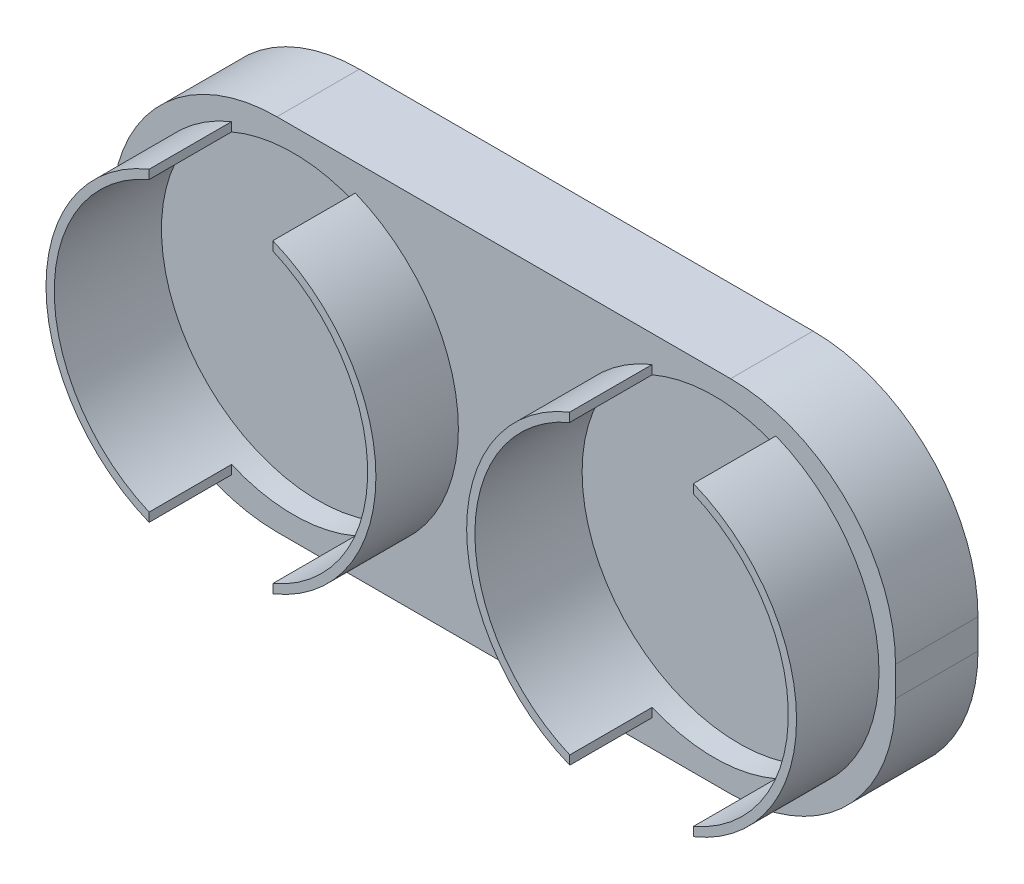
ISO-10303-21;
HEADER;
FILE_DESCRIPTION(('STEP AP214'),'2;1');
FILE_NAME('part.step','',(''),(''),'','','');
FILE_SCHEMA(('AUTOMOTIVE_DESIGN { 1 0 10303 214 1 1 1 1 }'));
ENDSEC;
DATA;
#1=APPLICATION_CONTEXT('core data for automotive mechanical design processes');
#2=APPLICATION_PROTOCOL_DEFINITION('international standard','automotive_design',2000,#1);
#3=PRODUCT_CONTEXT('',#1,'mechanical');
#4=PRODUCT('Part','Part','',(#3));
#5=PRODUCT_RELATED_PRODUCT_CATEGORY('part','',(#4));
#6=PRODUCT_DEFINITION_FORMATION('','',#4);
#7=PRODUCT_DEFINITION_CONTEXT('part definition',#1,'design');
#8=PRODUCT_DEFINITION('design','',#6,#7);
#9=PRODUCT_DEFINITION_SHAPE('','',#8);
#10=(LENGTH_UNIT() NAMED_UNIT(*) SI_UNIT(.MILLI.,.METRE.));
#11=(NAMED_UNIT(*) PLANE_ANGLE_UNIT() SI_UNIT($,.RADIAN.));
#12=(NAMED_UNIT(*) SI_UNIT($,.STERADIAN.) SOLID_ANGLE_UNIT());
#13=UNCERTAINTY_MEASURE_WITH_UNIT(LENGTH_MEASURE(1.E-05),#10,'distance_accuracy_value','');
#14=(GEOMETRIC_REPRESENTATION_CONTEXT(3) GLOBAL_UNCERTAINTY_ASSIGNED_CONTEXT((#13)) GLOBAL_UNIT_ASSIGNED_CONTEXT((#10,
#11,#12)) REPRESENTATION_CONTEXT('',''));
#15=CARTESIAN_POINT('',(0.,0.,0.));
#16=DIRECTION('',(0.,0.,1.));
#17=DIRECTION('',(1.,0.,0.));
#18=AXIS2_PLACEMENT_3D('',#15,#16,#17);
#19=CARTESIAN_POINT('',(0.,0.,10.));
#20=DIRECTION('',(0.,0.,-1.));
#21=DIRECTION('',(-1.,0.,0.));
#22=AXIS2_PLACEMENT_3D('',#19,#20,#21);
#23=PLANE('',#22);
#24=CARTESIAN_POINT('',(25.5,0.,10.));
#25=DIRECTION('',(0.,0.,1.));
#26=DIRECTION('',(-1.,0.,0.));
#27=AXIS2_PLACEMENT_3D('',#24,#25,#26);
#28=CIRCLE('',#27,19.);
#29=CARTESIAN_POINT('',(18.,-17.4570902500961,10.));
#30=VERTEX_POINT('',#29);
#31=CARTESIAN_POINT('',(33.,-17.4570902500961,10.));
#32=VERTEX_POINT('',#31);
#33=EDGE_CURVE('E201',#30,#32,#28,.T.);
#34=ORIENTED_EDGE('',*,*,#33,.F.);
#35=DIRECTION('',(0.,-1.,0.));
#36=VECTOR('',#35,1.);
#37=CARTESIAN_POINT('',(18.,-21.8,10.));
#38=LINE('',#37,#36);
#39=CARTESIAN_POINT('',(18.,-18.5404962177391,10.));
#40=VERTEX_POINT('',#39);
#41=EDGE_CURVE('E206',#30,#40,#38,.T.);
#42=ORIENTED_EDGE('',*,*,#41,.T.);
#43=CARTESIAN_POINT('',(25.5,0.,10.));
#44=DIRECTION('',(0.,0.,1.));
#45=DIRECTION('',(1.,0.,0.));
#46=AXIS2_PLACEMENT_3D('',#43,#44,#45);
#47=CIRCLE('',#46,20.);
#48=CARTESIAN_POINT('',(18.,18.5404962177392,10.));
#49=VERTEX_POINT('',#48);
#50=EDGE_CURVE('E261',#40,#49,#47,.F.);
#51=ORIENTED_EDGE('',*,*,#50,.T.);
#52=CARTESIAN_POINT('',(18.,17.4570902500961,10.));
#53=VERTEX_POINT('',#52);
#54=EDGE_CURVE('E224',#49,#53,#38,.T.);
#55=ORIENTED_EDGE('',*,*,#54,.T.);
#56=CARTESIAN_POINT('',(33.,17.4570902500961,10.));
#57=VERTEX_POINT('',#56);
#58=EDGE_CURVE('E214',#57,#53,#28,.T.);
#59=ORIENTED_EDGE('',*,*,#58,.F.);
#60=DIRECTION('',(0.,1.,0.));
#61=VECTOR('',#60,1.);
#62=CARTESIAN_POINT('',(33.,-21.8,10.));
#63=LINE('',#62,#61);
#64=CARTESIAN_POINT('',(33.,18.5404962177392,10.));
#65=VERTEX_POINT('',#64);
#66=EDGE_CURVE('E674',#57,#65,#63,.T.);
#67=ORIENTED_EDGE('',*,*,#66,.T.);
#68=CARTESIAN_POINT('',(33.,-18.5404962177392,10.));
#69=VERTEX_POINT('',#68);
#70=EDGE_CURVE('E245',#65,#69,#47,.F.);
#71=ORIENTED_EDGE('',*,*,#70,.T.);
#72=EDGE_CURVE('E207',#69,#32,#63,.T.);
#73=ORIENTED_EDGE('',*,*,#72,.T.);
#74=EDGE_LOOP('',(#34,#42,#51,#55,#59,#67,#71,#73));
#75=FACE_BOUND('',#74,.T.);
#76=DIRECTION('',(-1.,0.,0.));
#77=VECTOR('',#76,1.);
#78=CARTESIAN_POINT('',(47.5,21.8,10.));
#79=LINE('',#78,#77);
#80=CARTESIAN_POINT('',(27.5,21.8,10.));
#81=VERTEX_POINT('',#80);
#82=CARTESIAN_POINT('',(-27.5,21.8,10.));
#83=VERTEX_POINT('',#82);
#84=EDGE_CURVE('E276',#81,#83,#79,.T.);
#85=ORIENTED_EDGE('',*,*,#84,.T.);
#86=CARTESIAN_POINT('',(-27.5,1.8,10.));
#87=DIRECTION('',(0.,0.,-1.));
#88=DIRECTION('',(-1.,0.,0.));
#89=AXIS2_PLACEMENT_3D('',#86,#87,#88);
#90=CIRCLE('',#89,20.);
#91=CARTESIAN_POINT('',(-47.5,1.8,10.));
#92=VERTEX_POINT('',#91);
#93=EDGE_CURVE('E321',#83,#92,#90,.F.);
#94=ORIENTED_EDGE('',*,*,#93,.T.);
#95=DIRECTION('',(0.,-1.,0.));
#96=VECTOR('',#95,1.);
#97=CARTESIAN_POINT('',(-47.5,-21.8,10.));
#98=LINE('',#97,#96);
#99=CARTESIAN_POINT('',(-47.5,-1.8,10.));
#100=VERTEX_POINT('',#99);
#101=EDGE_CURVE('E284',#92,#100,#98,.T.);
#102=ORIENTED_EDGE('',*,*,#101,.T.);
#103=CARTESIAN_POINT('',(-27.5,-1.8,10.));
#104=DIRECTION('',(0.,0.,-1.));
#105=DIRECTION('',(-1.,0.,0.));
#106=AXIS2_PLACEMENT_3D('',#103,#104,#105);
#107=CIRCLE('',#106,20.);
#108=CARTESIAN_POINT('',(-27.5,-21.8,10.));
#109=VERTEX_POINT('',#108);
#110=EDGE_CURVE('E317',#100,#109,#107,.F.);
#111=ORIENTED_EDGE('',*,*,#110,.T.);
#112=DIRECTION('',(1.,0.,0.));
#113=VECTOR('',#112,1.);
#114=CARTESIAN_POINT('',(47.5,-21.8,10.));
#115=LINE('',#114,#113);
#116=CARTESIAN_POINT('',(27.5,-21.8,10.));
#117=VERTEX_POINT('',#116);
#118=EDGE_CURVE('E287',#109,#117,#115,.T.);
#119=ORIENTED_EDGE('',*,*,#118,.T.);
#120=CARTESIAN_POINT('',(27.5,-1.8,10.));
#121=DIRECTION('',(0.,0.,-1.));
#122=DIRECTION('',(-1.,0.,0.));
#123=AXIS2_PLACEMENT_3D('',#120,#121,#122);
#124=CIRCLE('',#123,20.);
#125=CARTESIAN_POINT('',(47.5,-1.8,10.));
#126=VERTEX_POINT('',#125);
#127=EDGE_CURVE('E64',#117,#126,#124,.F.);
#128=ORIENTED_EDGE('',*,*,#127,.T.);
#129=DIRECTION('',(0.,1.,0.));
#130=VECTOR('',#129,1.);
#131=CARTESIAN_POINT('',(47.5,-21.8,10.));
#132=LINE('',#131,#130);
#133=CARTESIAN_POINT('',(47.5,1.8,10.));
#134=VERTEX_POINT('',#133);
#135=EDGE_CURVE('E272',#126,#134,#132,.T.);
#136=ORIENTED_EDGE('',*,*,#135,.T.);
#137=CARTESIAN_POINT('',(27.5,1.8,10.));
#138=DIRECTION('',(0.,0.,-1.));
#139=DIRECTION('',(-1.,0.,0.));
#140=AXIS2_PLACEMENT_3D('',#137,#138,#139);
#141=CIRCLE('',#140,20.);
#142=EDGE_CURVE('E316',#134,#81,#141,.F.);
#143=ORIENTED_EDGE('',*,*,#142,.T.);
#144=EDGE_LOOP('',(#85,#94,#102,#111,#119,#128,#136,#143));
#145=FACE_BOUND('',#144,.T.);
#146=CARTESIAN_POINT('',(-25.5,0.,10.));
#147=DIRECTION('',(0.,0.,1.));
#148=DIRECTION('',(1.,0.,0.));
#149=AXIS2_PLACEMENT_3D('',#146,#147,#148);
#150=CIRCLE('',#149,19.);
#151=CARTESIAN_POINT('',(-18.,17.4570902500961,10.));
#152=VERTEX_POINT('',#151);
#153=CARTESIAN_POINT('',(-33.,17.4570902500961,10.));
#154=VERTEX_POINT('',#153);
#155=EDGE_CURVE('E737',#152,#154,#150,.T.);
#156=ORIENTED_EDGE('',*,*,#155,.F.);
#157=DIRECTION('',(0.,1.,0.));
#158=VECTOR('',#157,1.);
#159=CARTESIAN_POINT('',(-18.,-21.8,10.));
#160=LINE('',#159,#158);
#161=CARTESIAN_POINT('',(-18.,18.5404962177392,10.));
#162=VERTEX_POINT('',#161);
#163=EDGE_CURVE('E726',#152,#162,#160,.T.);
#164=ORIENTED_EDGE('',*,*,#163,.T.);
#165=CARTESIAN_POINT('',(-25.5,0.,10.));
#166=DIRECTION('',(0.,0.,1.));
#167=DIRECTION('',(1.,0.,0.));
#168=AXIS2_PLACEMENT_3D('',#165,#166,#167);
#169=CIRCLE('',#168,20.);
#170=CARTESIAN_POINT('',(-18.,-18.5404962177392,10.));
#171=VERTEX_POINT('',#170);
#172=EDGE_CURVE('E252',#171,#162,#169,.T.);
#173=ORIENTED_EDGE('',*,*,#172,.F.);
#174=CARTESIAN_POINT('',(-18.,-17.4570902500961,10.));
#175=VERTEX_POINT('',#174);
#176=EDGE_CURVE('E696',#171,#175,#160,.T.);
#177=ORIENTED_EDGE('',*,*,#176,.T.);
#178=CARTESIAN_POINT('',(-33.,-17.4570902500961,10.));
#179=VERTEX_POINT('',#178);
#180=EDGE_CURVE('E212',#179,#175,#150,.T.);
#181=ORIENTED_EDGE('',*,*,#180,.F.);
#182=DIRECTION('',(0.,-1.,0.));
#183=VECTOR('',#182,1.);
#184=CARTESIAN_POINT('',(-33.,-21.8,10.));
#185=LINE('',#184,#183);
#186=CARTESIAN_POINT('',(-33.,-18.5404962177392,10.));
#187=VERTEX_POINT('',#186);
#188=EDGE_CURVE('E721',#179,#187,#185,.T.);
#189=ORIENTED_EDGE('',*,*,#188,.T.);
#190=CARTESIAN_POINT('',(-33.,18.5404962177392,10.));
#191=VERTEX_POINT('',#190);
#192=EDGE_CURVE('E254',#191,#187,#169,.T.);
#193=ORIENTED_EDGE('',*,*,#192,.F.);
#194=EDGE_CURVE('E730',#191,#154,#185,.T.);
#195=ORIENTED_EDGE('',*,*,#194,.T.);
#196=EDGE_LOOP('',(#156,#164,#173,#177,#181,#189,#193,#195));
#197=FACE_BOUND('',#196,.T.);
#198=ADVANCED_FACE('F41',(#75,#145,#197),#23,.F.);
#199=CARTESIAN_POINT('',(25.5,0.,20.));
#200=DIRECTION('',(0.,0.,-1.));
#201=DIRECTION('',(-1.,0.,0.));
#202=AXIS2_PLACEMENT_3D('',#199,#200,#201);
#203=CYLINDRICAL_SURFACE('',#202,20.);
#204=DIRECTION('',(0.,0.,-1.));
#205=VECTOR('',#204,1.);
#206=CARTESIAN_POINT('',(18.,18.5404962177392,20.));
#207=LINE('',#206,#205);
#208=CARTESIAN_POINT('',(18.,18.5404962177392,20.));
#209=VERTEX_POINT('',#208);
#210=EDGE_CURVE('E242',#49,#209,#207,.F.);
#211=ORIENTED_EDGE('',*,*,#210,.F.);
#212=ORIENTED_EDGE('',*,*,#50,.F.);
#213=DIRECTION('',(0.,0.,-1.));
#214=VECTOR('',#213,1.);
#215=CARTESIAN_POINT('',(18.,-18.5404962177391,20.));
#216=LINE('',#215,#214);
#217=CARTESIAN_POINT('',(18.,-18.5404962177391,20.));
#218=VERTEX_POINT('',#217);
#219=EDGE_CURVE('E225',#218,#40,#216,.T.);
#220=ORIENTED_EDGE('',*,*,#219,.F.);
#221=CARTESIAN_POINT('',(25.5,0.,20.));
#222=DIRECTION('',(0.,0.,1.));
#223=DIRECTION('',(1.,0.,0.));
#224=AXIS2_PLACEMENT_3D('',#221,#222,#223);
#225=CIRCLE('',#224,20.);
#226=EDGE_CURVE('E257',#218,#209,#225,.F.);
#227=ORIENTED_EDGE('',*,*,#226,.T.);
#228=EDGE_LOOP('',(#211,#212,#220,#227));
#229=FACE_BOUND('',#228,.T.);
#230=ADVANCED_FACE('F371',(#229),#203,.T.);
#231=CARTESIAN_POINT('',(0.,0.,20.));
#232=DIRECTION('',(0.,0.,1.));
#233=DIRECTION('',(1.,0.,0.));
#234=AXIS2_PLACEMENT_3D('',#231,#232,#233);
#235=PLANE('',#234);
#236=DIRECTION('',(0.,1.,0.));
#237=VECTOR('',#236,1.);
#238=CARTESIAN_POINT('',(33.,-21.8,20.));
#239=LINE('',#238,#237);
#240=CARTESIAN_POINT('',(33.,-18.5404962177392,20.));
#241=VERTEX_POINT('',#240);
#242=CARTESIAN_POINT('',(33.,-17.4570902500961,20.));
#243=VERTEX_POINT('',#242);
#244=EDGE_CURVE('E681',#241,#243,#239,.T.);
#245=ORIENTED_EDGE('',*,*,#244,.F.);
#246=CARTESIAN_POINT('',(33.,18.5404962177392,20.));
#247=VERTEX_POINT('',#246);
#248=EDGE_CURVE('E260',#247,#241,#225,.F.);
#249=ORIENTED_EDGE('',*,*,#248,.F.);
#250=CARTESIAN_POINT('',(33.,17.4570902500961,20.));
#251=VERTEX_POINT('',#250);
#252=EDGE_CURVE('E673',#251,#247,#239,.T.);
#253=ORIENTED_EDGE('',*,*,#252,.F.);
#254=CARTESIAN_POINT('',(25.5,0.,20.));
#255=DIRECTION('',(0.,0.,1.));
#256=DIRECTION('',(1.,0.,0.));
#257=AXIS2_PLACEMENT_3D('',#254,#255,#256);
#258=CIRCLE('',#257,19.);
#259=EDGE_CURVE('E265',#251,#243,#258,.F.);
#260=ORIENTED_EDGE('',*,*,#259,.T.);
#261=EDGE_LOOP('',(#245,#249,#253,#260));
#262=FACE_BOUND('',#261,.T.);
#263=ADVANCED_FACE('F378',(#262),#235,.T.);
#264=CARTESIAN_POINT('',(-25.5,0.,20.));
#265=DIRECTION('',(0.,0.,-1.));
#266=DIRECTION('',(-1.,0.,0.));
#267=AXIS2_PLACEMENT_3D('',#264,#265,#266);
#268=CYLINDRICAL_SURFACE('',#267,20.);
#269=CARTESIAN_POINT('',(-25.5,0.,20.));
#270=DIRECTION('',(0.,0.,1.));
#271=DIRECTION('',(1.,0.,0.));
#272=AXIS2_PLACEMENT_3D('',#269,#270,#271);
#273=CIRCLE('',#272,20.);
#274=CARTESIAN_POINT('',(-33.,18.5404962177392,20.));
#275=VERTEX_POINT('',#274);
#276=CARTESIAN_POINT('',(-33.,-18.5404962177392,20.));
#277=VERTEX_POINT('',#276);
#278=EDGE_CURVE('E253',#275,#277,#273,.T.);
#279=ORIENTED_EDGE('',*,*,#278,.F.);
#280=DIRECTION('',(0.,0.,-1.));
#281=VECTOR('',#280,1.);
#282=CARTESIAN_POINT('',(-33.,18.5404962177392,20.));
#283=LINE('',#282,#281);
#284=EDGE_CURVE('E707',#275,#191,#283,.T.);
#285=ORIENTED_EDGE('',*,*,#284,.T.);
#286=ORIENTED_EDGE('',*,*,#192,.T.);
#287=DIRECTION('',(0.,0.,-1.));
#288=VECTOR('',#287,1.);
#289=CARTESIAN_POINT('',(-33.,-18.5404962177392,20.));
#290=LINE('',#289,#288);
#291=EDGE_CURVE('E706',#187,#277,#290,.F.);
#292=ORIENTED_EDGE('',*,*,#291,.T.);
#293=EDGE_LOOP('',(#279,#285,#286,#292));
#294=FACE_BOUND('',#293,.T.);
#295=ADVANCED_FACE('F528',(#294),#268,.T.);
#296=CARTESIAN_POINT('',(0.,0.,20.));
#297=DIRECTION('',(0.,0.,1.));
#298=DIRECTION('',(1.,0.,0.));
#299=AXIS2_PLACEMENT_3D('',#296,#297,#298);
#300=PLANE('',#299);
#301=DIRECTION('',(0.,1.,0.));
#302=VECTOR('',#301,1.);
#303=CARTESIAN_POINT('',(-18.,-21.8,20.));
#304=LINE('',#303,#302);
#305=CARTESIAN_POINT('',(-18.,-18.5404962177392,20.));
#306=VERTEX_POINT('',#305);
#307=CARTESIAN_POINT('',(-18.,-17.4570902500961,20.));
#308=VERTEX_POINT('',#307);
#309=EDGE_CURVE('E689',#306,#308,#304,.T.);
#310=ORIENTED_EDGE('',*,*,#309,.F.);
#311=CARTESIAN_POINT('',(-18.,18.5404962177392,20.));
#312=VERTEX_POINT('',#311);
#313=EDGE_CURVE('E249',#306,#312,#273,.T.);
#314=ORIENTED_EDGE('',*,*,#313,.T.);
#315=CARTESIAN_POINT('',(-18.,17.4570902500961,20.));
#316=VERTEX_POINT('',#315);
#317=EDGE_CURVE('E687',#316,#312,#304,.T.);
#318=ORIENTED_EDGE('',*,*,#317,.F.);
#319=CARTESIAN_POINT('',(-25.5,0.,20.));
#320=DIRECTION('',(0.,0.,1.));
#321=DIRECTION('',(1.,0.,0.));
#322=AXIS2_PLACEMENT_3D('',#319,#320,#321);
#323=CIRCLE('',#322,19.);
#324=EDGE_CURVE('E241',#308,#316,#323,.T.);
#325=ORIENTED_EDGE('',*,*,#324,.F.);
#326=EDGE_LOOP('',(#310,#314,#318,#325));
#327=FACE_BOUND('',#326,.T.);
#328=ADVANCED_FACE('F389',(#327),#300,.T.);
#329=CARTESIAN_POINT('',(0.,0.,0.));
#330=DIRECTION('',(0.,0.,-1.));
#331=DIRECTION('',(-1.,0.,0.));
#332=AXIS2_PLACEMENT_3D('',#329,#330,#331);
#333=PLANE('',#332);
#334=CARTESIAN_POINT('',(0.,12.45,0.));
#335=DIRECTION('',(0.,0.,-1.));
#336=DIRECTION('',(-1.,0.,0.));
#337=AXIS2_PLACEMENT_3D('',#334,#335,#336);
#338=CIRCLE('',#337,3.9);
#339=CARTESIAN_POINT('',(-3.9,12.45,0.));
#340=VERTEX_POINT('',#339);
#341=EDGE_CURVE('E277',#340,#340,#338,.F.);
#342=ORIENTED_EDGE('',*,*,#341,.T.);
#343=EDGE_LOOP('',(#342));
#344=FACE_BOUND('',#343,.T.);
#345=DIRECTION('',(0.,-1.,0.));
#346=VECTOR('',#345,1.);
#347=CARTESIAN_POINT('',(-47.5,-21.8,0.));
#348=LINE('',#347,#346);
#349=CARTESIAN_POINT('',(-47.5,1.8,0.));
#350=VERTEX_POINT('',#349);
#351=CARTESIAN_POINT('',(-47.5,-1.8,0.));
#352=VERTEX_POINT('',#351);
#353=EDGE_CURVE('E292',#350,#352,#348,.T.);
#354=ORIENTED_EDGE('',*,*,#353,.F.);
#355=CARTESIAN_POINT('',(-27.5,1.8,0.));
#356=DIRECTION('',(0.,0.,-1.));
#357=DIRECTION('',(-1.,0.,0.));
#358=AXIS2_PLACEMENT_3D('',#355,#356,#357);
#359=CIRCLE('',#358,20.);
#360=CARTESIAN_POINT('',(-27.5,21.8,0.));
#361=VERTEX_POINT('',#360);
#362=EDGE_CURVE('E310',#350,#361,#359,.T.);
#363=ORIENTED_EDGE('',*,*,#362,.T.);
#364=DIRECTION('',(-1.,0.,0.));
#365=VECTOR('',#364,1.);
#366=CARTESIAN_POINT('',(47.5,21.8,0.));
#367=LINE('',#366,#365);
#368=CARTESIAN_POINT('',(27.5,21.8,0.));
#369=VERTEX_POINT('',#368);
#370=EDGE_CURVE('E267',#369,#361,#367,.T.);
#371=ORIENTED_EDGE('',*,*,#370,.F.);
#372=CARTESIAN_POINT('',(27.5,1.8,0.));
#373=DIRECTION('',(0.,0.,-1.));
#374=DIRECTION('',(-1.,0.,0.));
#375=AXIS2_PLACEMENT_3D('',#372,#373,#374);
#376=CIRCLE('',#375,20.);
#377=CARTESIAN_POINT('',(47.5,1.8,0.));
#378=VERTEX_POINT('',#377);
#379=EDGE_CURVE('E304',#369,#378,#376,.T.);
#380=ORIENTED_EDGE('',*,*,#379,.T.);
#381=DIRECTION('',(0.,1.,0.));
#382=VECTOR('',#381,1.);
#383=CARTESIAN_POINT('',(47.5,-21.8,0.));
#384=LINE('',#383,#382);
#385=CARTESIAN_POINT('',(47.5,-1.8,0.));
#386=VERTEX_POINT('',#385);
#387=EDGE_CURVE('E285',#386,#378,#384,.T.);
#388=ORIENTED_EDGE('',*,*,#387,.F.);
#389=CARTESIAN_POINT('',(27.5,-1.8,0.));
#390=DIRECTION('',(0.,0.,-1.));
#391=DIRECTION('',(-1.,0.,0.));
#392=AXIS2_PLACEMENT_3D('',#389,#390,#391);
#393=CIRCLE('',#392,20.);
#394=CARTESIAN_POINT('',(27.5,-21.8,0.));
#395=VERTEX_POINT('',#394);
#396=EDGE_CURVE('E303',#386,#395,#393,.T.);
#397=ORIENTED_EDGE('',*,*,#396,.T.);
#398=DIRECTION('',(1.,0.,0.));
#399=VECTOR('',#398,1.);
#400=CARTESIAN_POINT('',(47.5,-21.8,0.));
#401=LINE('',#400,#399);
#402=CARTESIAN_POINT('',(-27.5,-21.8,0.));
#403=VERTEX_POINT('',#402);
#404=EDGE_CURVE('E294',#403,#395,#401,.T.);
#405=ORIENTED_EDGE('',*,*,#404,.F.);
#406=CARTESIAN_POINT('',(-27.5,-1.8,0.));
#407=DIRECTION('',(0.,0.,-1.));
#408=DIRECTION('',(-1.,0.,0.));
#409=AXIS2_PLACEMENT_3D('',#406,#407,#408);
#410=CIRCLE('',#409,20.);
#411=EDGE_CURVE('E307',#403,#352,#410,.T.);
#412=ORIENTED_EDGE('',*,*,#411,.T.);
#413=EDGE_LOOP('',(#354,#363,#371,#380,#388,#397,#405,#412));
#414=FACE_BOUND('',#413,.T.);
#415=CARTESIAN_POINT('',(0.,-12.45,0.));
#416=DIRECTION('',(0.,0.,-1.));
#417=DIRECTION('',(-1.,0.,0.));
#418=AXIS2_PLACEMENT_3D('',#415,#416,#417);
#419=CIRCLE('',#418,3.9);
#420=CARTESIAN_POINT('',(-3.9,-12.45,0.));
#421=VERTEX_POINT('',#420);
#422=EDGE_CURVE('E258',#421,#421,#419,.T.);
#423=ORIENTED_EDGE('',*,*,#422,.F.);
#424=EDGE_LOOP('',(#423));
#425=FACE_BOUND('',#424,.T.);
#426=ADVANCED_FACE('F339',(#344,#414,#425),#333,.T.);
#427=CARTESIAN_POINT('',(47.5,21.8,10.));
#428=DIRECTION('',(0.,-1.,0.));
#429=DIRECTION('',(0.,0.,-1.));
#430=AXIS2_PLACEMENT_3D('',#427,#428,#429);
#431=PLANE('',#430);
#432=ORIENTED_EDGE('',*,*,#370,.T.);
#433=DIRECTION('',(0.,0.,-1.));
#434=VECTOR('',#433,1.);
#435=CARTESIAN_POINT('',(-27.5,21.8,10.));
#436=LINE('',#435,#434);
#437=EDGE_CURVE('E314',#361,#83,#436,.F.);
#438=ORIENTED_EDGE('',*,*,#437,.T.);
#439=ORIENTED_EDGE('',*,*,#84,.F.);
#440=DIRECTION('',(0.,0.,-1.));
#441=VECTOR('',#440,1.);
#442=CARTESIAN_POINT('',(27.5,21.8,10.));
#443=LINE('',#442,#441);
#444=EDGE_CURVE('E313',#81,#369,#443,.T.);
#445=ORIENTED_EDGE('',*,*,#444,.T.);
#446=EDGE_LOOP('',(#432,#438,#439,#445));
#447=FACE_BOUND('',#446,.T.);
#448=ADVANCED_FACE('F352',(#447),#431,.F.);
#449=CARTESIAN_POINT('',(-47.5,-21.8,10.));
#450=DIRECTION('',(1.,0.,0.));
#451=DIRECTION('',(0.,0.,-1.));
#452=AXIS2_PLACEMENT_3D('',#449,#450,#451);
#453=PLANE('',#452);
#454=ORIENTED_EDGE('',*,*,#101,.F.);
#455=DIRECTION('',(0.,0.,-1.));
#456=VECTOR('',#455,1.);
#457=CARTESIAN_POINT('',(-47.5,1.8,10.));
#458=LINE('',#457,#456);
#459=EDGE_CURVE('E298',#92,#350,#458,.T.);
#460=ORIENTED_EDGE('',*,*,#459,.T.);
#461=ORIENTED_EDGE('',*,*,#353,.T.);
#462=DIRECTION('',(0.,0.,-1.));
#463=VECTOR('',#462,1.);
#464=CARTESIAN_POINT('',(-47.5,-1.8,10.));
#465=LINE('',#464,#463);
#466=EDGE_CURVE('E300',#352,#100,#465,.F.);
#467=ORIENTED_EDGE('',*,*,#466,.T.);
#468=EDGE_LOOP('',(#454,#460,#461,#467));
#469=FACE_BOUND('',#468,.T.);
#470=ADVANCED_FACE('F356',(#469),#453,.F.);
#471=CARTESIAN_POINT('',(47.5,-21.8,10.));
#472=DIRECTION('',(0.,1.,0.));
#473=DIRECTION('',(0.,0.,1.));
#474=AXIS2_PLACEMENT_3D('',#471,#472,#473);
#475=PLANE('',#474);
#476=ORIENTED_EDGE('',*,*,#118,.F.);
#477=DIRECTION('',(0.,0.,-1.));
#478=VECTOR('',#477,1.);
#479=CARTESIAN_POINT('',(-27.5,-21.8,10.));
#480=LINE('',#479,#478);
#481=EDGE_CURVE('E324',#109,#403,#480,.T.);
#482=ORIENTED_EDGE('',*,*,#481,.T.);
#483=ORIENTED_EDGE('',*,*,#404,.T.);
#484=DIRECTION('',(0.,0.,-1.));
#485=VECTOR('',#484,1.);
#486=CARTESIAN_POINT('',(27.5,-21.8,10.));
#487=LINE('',#486,#485);
#488=EDGE_CURVE('E323',#395,#117,#487,.F.);
#489=ORIENTED_EDGE('',*,*,#488,.T.);
#490=EDGE_LOOP('',(#476,#482,#483,#489));
#491=FACE_BOUND('',#490,.T.);
#492=ADVANCED_FACE('F332',(#491),#475,.F.);
#493=CARTESIAN_POINT('',(47.5,-21.8,10.));
#494=DIRECTION('',(-1.,0.,0.));
#495=DIRECTION('',(0.,0.,1.));
#496=AXIS2_PLACEMENT_3D('',#493,#494,#495);
#497=PLANE('',#496);
#498=ORIENTED_EDGE('',*,*,#135,.F.);
#499=DIRECTION('',(0.,0.,-1.));
#500=VECTOR('',#499,1.);
#501=CARTESIAN_POINT('',(47.5,-1.8,10.));
#502=LINE('',#501,#500);
#503=EDGE_CURVE('E11',#126,#386,#502,.T.);
#504=ORIENTED_EDGE('',*,*,#503,.T.);
#505=ORIENTED_EDGE('',*,*,#387,.T.);
#506=DIRECTION('',(0.,0.,-1.));
#507=VECTOR('',#506,1.);
#508=CARTESIAN_POINT('',(47.5,1.8,10.));
#509=LINE('',#508,#507);
#510=EDGE_CURVE('E47',#378,#134,#509,.F.);
#511=ORIENTED_EDGE('',*,*,#510,.T.);
#512=EDGE_LOOP('',(#498,#504,#505,#511));
#513=FACE_BOUND('',#512,.T.);
#514=ADVANCED_FACE('F344',(#513),#497,.F.);
#515=CARTESIAN_POINT('',(0.,12.45,-4.));
#516=DIRECTION('',(0.,0.,1.));
#517=DIRECTION('',(1.,0.,0.));
#518=AXIS2_PLACEMENT_3D('',#515,#516,#517);
#519=CYLINDRICAL_SURFACE('',#518,3.9);
#520=CARTESIAN_POINT('',(0.,12.45,-4.));
#521=DIRECTION('',(0.,0.,-1.));
#522=DIRECTION('',(-1.,0.,0.));
#523=AXIS2_PLACEMENT_3D('',#520,#521,#522);
#524=CIRCLE('',#523,3.9);
#525=CARTESIAN_POINT('',(-3.9,12.45,-4.));
#526=VERTEX_POINT('',#525);
#527=EDGE_CURVE('E269',#526,#526,#524,.F.);
#528=ORIENTED_EDGE('',*,*,#527,.T.);
#529=EDGE_LOOP('',(#528));
#530=FACE_BOUND('',#529,.T.);
#531=ORIENTED_EDGE('',*,*,#341,.F.);
#532=EDGE_LOOP('',(#531));
#533=FACE_BOUND('',#532,.T.);
#534=ADVANCED_FACE('F383',(#530,#533),#519,.T.);
#535=CARTESIAN_POINT('',(0.,0.,-4.));
#536=DIRECTION('',(0.,0.,-1.));
#537=DIRECTION('',(-1.,0.,0.));
#538=AXIS2_PLACEMENT_3D('',#535,#536,#537);
#539=PLANE('',#538);
#540=ORIENTED_EDGE('',*,*,#527,.F.);
#541=EDGE_LOOP('',(#540));
#542=FACE_BOUND('',#541,.T.);
#543=ADVANCED_FACE('F537',(#542),#539,.T.);
#544=CARTESIAN_POINT('',(0.,-12.45,-4.));
#545=DIRECTION('',(0.,0.,1.));
#546=DIRECTION('',(1.,0.,0.));
#547=AXIS2_PLACEMENT_3D('',#544,#545,#546);
#548=CYLINDRICAL_SURFACE('',#547,3.9);
#549=CARTESIAN_POINT('',(0.,-12.45,-4.));
#550=DIRECTION('',(0.,0.,-1.));
#551=DIRECTION('',(-1.,0.,0.));
#552=AXIS2_PLACEMENT_3D('',#549,#550,#551);
#553=CIRCLE('',#552,3.9);
#554=CARTESIAN_POINT('',(-3.9,-12.45,-4.));
#555=VERTEX_POINT('',#554);
#556=EDGE_CURVE('E266',#555,#555,#553,.T.);
#557=ORIENTED_EDGE('',*,*,#556,.F.);
#558=EDGE_LOOP('',(#557));
#559=FACE_BOUND('',#558,.T.);
#560=ORIENTED_EDGE('',*,*,#422,.T.);
#561=EDGE_LOOP('',(#560));
#562=FACE_BOUND('',#561,.T.);
#563=ADVANCED_FACE('F536',(#559,#562),#548,.T.);
#564=CARTESIAN_POINT('',(0.,0.,-4.));
#565=DIRECTION('',(0.,0.,-1.));
#566=DIRECTION('',(-1.,0.,0.));
#567=AXIS2_PLACEMENT_3D('',#564,#565,#566);
#568=PLANE('',#567);
#569=ORIENTED_EDGE('',*,*,#556,.T.);
#570=EDGE_LOOP('',(#569));
#571=FACE_BOUND('',#570,.T.);
#572=ADVANCED_FACE('F535',(#571),#568,.T.);
#573=DIRECTION('',(0.,0.,-1.));
#574=VECTOR('',#573,1.);
#575=CARTESIAN_POINT('',(33.,-18.5404962177392,20.));
#576=LINE('',#575,#574);
#577=EDGE_CURVE('E234',#69,#241,#576,.F.);
#578=ORIENTED_EDGE('',*,*,#577,.F.);
#579=ORIENTED_EDGE('',*,*,#70,.F.);
#580=DIRECTION('',(0.,0.,-1.));
#581=VECTOR('',#580,1.);
#582=CARTESIAN_POINT('',(33.,18.5404962177392,20.));
#583=LINE('',#582,#581);
#584=EDGE_CURVE('E237',#247,#65,#583,.T.);
#585=ORIENTED_EDGE('',*,*,#584,.F.);
#586=ORIENTED_EDGE('',*,*,#248,.T.);
#587=EDGE_LOOP('',(#578,#579,#585,#586));
#588=FACE_BOUND('',#587,.T.);
#589=ADVANCED_FACE('F381',(#588),#203,.T.);
#590=CARTESIAN_POINT('',(25.5,0.,20.));
#591=DIRECTION('',(0.,0.,-1.));
#592=DIRECTION('',(-1.,0.,0.));
#593=AXIS2_PLACEMENT_3D('',#590,#591,#592);
#594=CYLINDRICAL_SURFACE('',#593,19.);
#595=DIRECTION('',(0.,0.,-1.));
#596=VECTOR('',#595,1.);
#597=CARTESIAN_POINT('',(33.,17.4570902500961,20.));
#598=LINE('',#597,#596);
#599=EDGE_CURVE('E720',#251,#57,#598,.T.);
#600=ORIENTED_EDGE('',*,*,#599,.T.);
#601=ORIENTED_EDGE('',*,*,#58,.T.);
#602=DIRECTION('',(0.,0.,-1.));
#603=VECTOR('',#602,1.);
#604=CARTESIAN_POINT('',(18.,17.4570902500961,20.));
#605=LINE('',#604,#603);
#606=CARTESIAN_POINT('',(18.,17.4570902500961,20.));
#607=VERTEX_POINT('',#606);
#608=EDGE_CURVE('E235',#53,#607,#605,.F.);
#609=ORIENTED_EDGE('',*,*,#608,.T.);
#610=CARTESIAN_POINT('',(18.,-17.4570902500961,20.));
#611=VERTEX_POINT('',#610);
#612=EDGE_CURVE('E232',#611,#607,#258,.F.);
#613=ORIENTED_EDGE('',*,*,#612,.F.);
#614=DIRECTION('',(0.,0.,-1.));
#615=VECTOR('',#614,1.);
#616=CARTESIAN_POINT('',(18.,-17.4570902500961,20.));
#617=LINE('',#616,#615);
#618=EDGE_CURVE('E218',#611,#30,#617,.T.);
#619=ORIENTED_EDGE('',*,*,#618,.T.);
#620=ORIENTED_EDGE('',*,*,#33,.T.);
#621=DIRECTION('',(0.,0.,-1.));
#622=VECTOR('',#621,1.);
#623=CARTESIAN_POINT('',(33.,-17.4570902500961,20.));
#624=LINE('',#623,#622);
#625=EDGE_CURVE('E676',#32,#243,#624,.F.);
#626=ORIENTED_EDGE('',*,*,#625,.T.);
#627=ORIENTED_EDGE('',*,*,#259,.F.);
#628=EDGE_LOOP('',(#600,#601,#609,#613,#619,#620,#626,#627));
#629=FACE_BOUND('',#628,.T.);
#630=CARTESIAN_POINT('',(25.5,0.,7.));
#631=DIRECTION('',(0.,0.,1.));
#632=DIRECTION('',(-1.,0.,0.));
#633=AXIS2_PLACEMENT_3D('',#630,#631,#632);
#634=CIRCLE('',#633,19.);
#635=CARTESIAN_POINT('',(6.5,0.,7.));
#636=VERTEX_POINT('',#635);
#637=EDGE_CURVE('E718',#636,#636,#634,.T.);
#638=ORIENTED_EDGE('',*,*,#637,.F.);
#639=EDGE_LOOP('',(#638));
#640=FACE_BOUND('',#639,.T.);
#641=ADVANCED_FACE('F229',(#629,#640),#594,.F.);
#642=DIRECTION('',(0.,-1.,0.));
#643=VECTOR('',#642,1.);
#644=CARTESIAN_POINT('',(18.,-21.8,20.));
#645=LINE('',#644,#643);
#646=EDGE_CURVE('E688',#209,#607,#645,.T.);
#647=ORIENTED_EDGE('',*,*,#646,.F.);
#648=ORIENTED_EDGE('',*,*,#226,.F.);
#649=EDGE_CURVE('E692',#611,#218,#645,.T.);
#650=ORIENTED_EDGE('',*,*,#649,.F.);
#651=ORIENTED_EDGE('',*,*,#612,.T.);
#652=EDGE_LOOP('',(#647,#648,#650,#651));
#653=FACE_BOUND('',#652,.T.);
#654=ADVANCED_FACE('F465',(#653),#235,.T.);
#655=CARTESIAN_POINT('',(-25.5,0.,20.));
#656=DIRECTION('',(0.,0.,-1.));
#657=DIRECTION('',(-1.,0.,0.));
#658=AXIS2_PLACEMENT_3D('',#655,#656,#657);
#659=CYLINDRICAL_SURFACE('',#658,19.);
#660=DIRECTION('',(0.,0.,-1.));
#661=VECTOR('',#660,1.);
#662=CARTESIAN_POINT('',(-18.,-17.4570902500961,20.));
#663=LINE('',#662,#661);
#664=EDGE_CURVE('E703',#308,#175,#663,.T.);
#665=ORIENTED_EDGE('',*,*,#664,.F.);
#666=ORIENTED_EDGE('',*,*,#324,.T.);
#667=DIRECTION('',(0.,0.,-1.));
#668=VECTOR('',#667,1.);
#669=CARTESIAN_POINT('',(-18.,17.4570902500961,20.));
#670=LINE('',#669,#668);
#671=EDGE_CURVE('E701',#152,#316,#670,.F.);
#672=ORIENTED_EDGE('',*,*,#671,.F.);
#673=ORIENTED_EDGE('',*,*,#155,.T.);
#674=DIRECTION('',(0.,0.,-1.));
#675=VECTOR('',#674,1.);
#676=CARTESIAN_POINT('',(-33.,17.4570902500961,20.));
#677=LINE('',#676,#675);
#678=CARTESIAN_POINT('',(-33.,17.4570902500961,20.));
#679=VERTEX_POINT('',#678);
#680=EDGE_CURVE('E713',#679,#154,#677,.T.);
#681=ORIENTED_EDGE('',*,*,#680,.F.);
#682=CARTESIAN_POINT('',(-33.,-17.4570902500961,20.));
#683=VERTEX_POINT('',#682);
#684=EDGE_CURVE('E250',#679,#683,#323,.T.);
#685=ORIENTED_EDGE('',*,*,#684,.T.);
#686=DIRECTION('',(0.,0.,-1.));
#687=VECTOR('',#686,1.);
#688=CARTESIAN_POINT('',(-33.,-17.4570902500961,20.));
#689=LINE('',#688,#687);
#690=EDGE_CURVE('E715',#179,#683,#689,.F.);
#691=ORIENTED_EDGE('',*,*,#690,.F.);
#692=ORIENTED_EDGE('',*,*,#180,.T.);
#693=EDGE_LOOP('',(#665,#666,#672,#673,#681,#685,#691,#692));
#694=FACE_BOUND('',#693,.T.);
#695=CARTESIAN_POINT('',(-25.5,0.,7.));
#696=DIRECTION('',(0.,0.,1.));
#697=DIRECTION('',(1.,0.,0.));
#698=AXIS2_PLACEMENT_3D('',#695,#696,#697);
#699=CIRCLE('',#698,19.);
#700=CARTESIAN_POINT('',(-6.50000000000001,0.,7.));
#701=VERTEX_POINT('',#700);
#702=EDGE_CURVE('E678',#701,#701,#699,.T.);
#703=ORIENTED_EDGE('',*,*,#702,.F.);
#704=EDGE_LOOP('',(#703));
#705=FACE_BOUND('',#704,.T.);
#706=ADVANCED_FACE('F472',(#694,#705),#659,.F.);
#707=ORIENTED_EDGE('',*,*,#313,.F.);
#708=DIRECTION('',(0.,0.,-1.));
#709=VECTOR('',#708,1.);
#710=CARTESIAN_POINT('',(-18.,-18.5404962177392,20.));
#711=LINE('',#710,#709);
#712=EDGE_CURVE('E700',#306,#171,#711,.T.);
#713=ORIENTED_EDGE('',*,*,#712,.T.);
#714=ORIENTED_EDGE('',*,*,#172,.T.);
#715=DIRECTION('',(0.,0.,-1.));
#716=VECTOR('',#715,1.);
#717=CARTESIAN_POINT('',(-18.,18.5404962177392,20.));
#718=LINE('',#717,#716);
#719=EDGE_CURVE('E695',#162,#312,#718,.F.);
#720=ORIENTED_EDGE('',*,*,#719,.T.);
#721=EDGE_LOOP('',(#707,#713,#714,#720));
#722=FACE_BOUND('',#721,.T.);
#723=ADVANCED_FACE('F480',(#722),#268,.T.);
#724=DIRECTION('',(0.,-1.,0.));
#725=VECTOR('',#724,1.);
#726=CARTESIAN_POINT('',(-33.,-21.8,20.));
#727=LINE('',#726,#725);
#728=EDGE_CURVE('E729',#275,#679,#727,.T.);
#729=ORIENTED_EDGE('',*,*,#728,.F.);
#730=ORIENTED_EDGE('',*,*,#278,.T.);
#731=EDGE_CURVE('E735',#683,#277,#727,.T.);
#732=ORIENTED_EDGE('',*,*,#731,.F.);
#733=ORIENTED_EDGE('',*,*,#684,.F.);
#734=EDGE_LOOP('',(#729,#730,#732,#733));
#735=FACE_BOUND('',#734,.T.);
#736=ADVANCED_FACE('F514',(#735),#300,.T.);
#737=CARTESIAN_POINT('',(-33.,-21.8,-36.108133772687));
#738=DIRECTION('',(-1.,0.,0.));
#739=DIRECTION('',(0.,0.,1.));
#740=AXIS2_PLACEMENT_3D('',#737,#738,#739);
#741=PLANE('',#740);
#742=ORIENTED_EDGE('',*,*,#680,.T.);
#743=ORIENTED_EDGE('',*,*,#194,.F.);
#744=ORIENTED_EDGE('',*,*,#284,.F.);
#745=ORIENTED_EDGE('',*,*,#728,.T.);
#746=EDGE_LOOP('',(#742,#743,#744,#745));
#747=FACE_BOUND('',#746,.T.);
#748=ADVANCED_FACE('F515',(#747),#741,.F.);
#749=CARTESIAN_POINT('',(-18.,-21.8,-36.108133772687));
#750=DIRECTION('',(1.,0.,0.));
#751=DIRECTION('',(0.,1.,0.));
#752=AXIS2_PLACEMENT_3D('',#749,#750,#751);
#753=PLANE('',#752);
#754=ORIENTED_EDGE('',*,*,#671,.T.);
#755=ORIENTED_EDGE('',*,*,#317,.T.);
#756=ORIENTED_EDGE('',*,*,#719,.F.);
#757=ORIENTED_EDGE('',*,*,#163,.F.);
#758=EDGE_LOOP('',(#754,#755,#756,#757));
#759=FACE_BOUND('',#758,.T.);
#760=ADVANCED_FACE('F512',(#759),#753,.F.);
#761=ORIENTED_EDGE('',*,*,#690,.T.);
#762=ORIENTED_EDGE('',*,*,#731,.T.);
#763=ORIENTED_EDGE('',*,*,#291,.F.);
#764=ORIENTED_EDGE('',*,*,#188,.F.);
#765=EDGE_LOOP('',(#761,#762,#763,#764));
#766=FACE_BOUND('',#765,.T.);
#767=ADVANCED_FACE('F506',(#766),#741,.F.);
#768=ORIENTED_EDGE('',*,*,#664,.T.);
#769=ORIENTED_EDGE('',*,*,#176,.F.);
#770=ORIENTED_EDGE('',*,*,#712,.F.);
#771=ORIENTED_EDGE('',*,*,#309,.T.);
#772=EDGE_LOOP('',(#768,#769,#770,#771));
#773=FACE_BOUND('',#772,.T.);
#774=ADVANCED_FACE('F503',(#773),#753,.F.);
#775=CARTESIAN_POINT('',(33.,-21.8,-36.108133772687));
#776=DIRECTION('',(1.,0.,0.));
#777=DIRECTION('',(0.,0.,-1.));
#778=AXIS2_PLACEMENT_3D('',#775,#776,#777);
#779=PLANE('',#778);
#780=ORIENTED_EDGE('',*,*,#584,.T.);
#781=ORIENTED_EDGE('',*,*,#66,.F.);
#782=ORIENTED_EDGE('',*,*,#599,.F.);
#783=ORIENTED_EDGE('',*,*,#252,.T.);
#784=EDGE_LOOP('',(#780,#781,#782,#783));
#785=FACE_BOUND('',#784,.T.);
#786=ADVANCED_FACE('F509',(#785),#779,.F.);
#787=CARTESIAN_POINT('',(18.,-21.8,-36.108133772687));
#788=DIRECTION('',(-1.,0.,0.));
#789=DIRECTION('',(0.,-1.,0.));
#790=AXIS2_PLACEMENT_3D('',#787,#788,#789);
#791=PLANE('',#790);
#792=ORIENTED_EDGE('',*,*,#210,.T.);
#793=ORIENTED_EDGE('',*,*,#646,.T.);
#794=ORIENTED_EDGE('',*,*,#608,.F.);
#795=ORIENTED_EDGE('',*,*,#54,.F.);
#796=EDGE_LOOP('',(#792,#793,#794,#795));
#797=FACE_BOUND('',#796,.T.);
#798=ADVANCED_FACE('F517',(#797),#791,.F.);
#799=ORIENTED_EDGE('',*,*,#219,.T.);
#800=ORIENTED_EDGE('',*,*,#41,.F.);
#801=ORIENTED_EDGE('',*,*,#618,.F.);
#802=ORIENTED_EDGE('',*,*,#649,.T.);
#803=EDGE_LOOP('',(#799,#800,#801,#802));
#804=FACE_BOUND('',#803,.T.);
#805=ADVANCED_FACE('F217',(#804),#791,.F.);
#806=ORIENTED_EDGE('',*,*,#577,.T.);
#807=ORIENTED_EDGE('',*,*,#244,.T.);
#808=ORIENTED_EDGE('',*,*,#625,.F.);
#809=ORIENTED_EDGE('',*,*,#72,.F.);
#810=EDGE_LOOP('',(#806,#807,#808,#809));
#811=FACE_BOUND('',#810,.T.);
#812=ADVANCED_FACE('F366',(#811),#779,.F.);
#813=CARTESIAN_POINT('',(-27.5,1.8,10.));
#814=DIRECTION('',(0.,0.,-1.));
#815=DIRECTION('',(-1.,0.,0.));
#816=AXIS2_PLACEMENT_3D('',#813,#814,#815);
#817=CYLINDRICAL_SURFACE('',#816,20.);
#818=ORIENTED_EDGE('',*,*,#93,.F.);
#819=ORIENTED_EDGE('',*,*,#437,.F.);
#820=ORIENTED_EDGE('',*,*,#362,.F.);
#821=ORIENTED_EDGE('',*,*,#459,.F.);
#822=EDGE_LOOP('',(#818,#819,#820,#821));
#823=FACE_BOUND('',#822,.T.);
#824=ADVANCED_FACE('F357',(#823),#817,.T.);
#825=CARTESIAN_POINT('',(-27.5,-1.8,10.));
#826=DIRECTION('',(0.,0.,-1.));
#827=DIRECTION('',(-1.,0.,0.));
#828=AXIS2_PLACEMENT_3D('',#825,#826,#827);
#829=CYLINDRICAL_SURFACE('',#828,20.);
#830=ORIENTED_EDGE('',*,*,#110,.F.);
#831=ORIENTED_EDGE('',*,*,#466,.F.);
#832=ORIENTED_EDGE('',*,*,#411,.F.);
#833=ORIENTED_EDGE('',*,*,#481,.F.);
#834=EDGE_LOOP('',(#830,#831,#832,#833));
#835=FACE_BOUND('',#834,.T.);
#836=ADVANCED_FACE('F363',(#835),#829,.T.);
#837=CARTESIAN_POINT('',(27.5,-1.8,10.));
#838=DIRECTION('',(0.,0.,-1.));
#839=DIRECTION('',(-1.,0.,0.));
#840=AXIS2_PLACEMENT_3D('',#837,#838,#839);
#841=CYLINDRICAL_SURFACE('',#840,20.);
#842=ORIENTED_EDGE('',*,*,#127,.F.);
#843=ORIENTED_EDGE('',*,*,#488,.F.);
#844=ORIENTED_EDGE('',*,*,#396,.F.);
#845=ORIENTED_EDGE('',*,*,#503,.F.);
#846=EDGE_LOOP('',(#842,#843,#844,#845));
#847=FACE_BOUND('',#846,.T.);
#848=ADVANCED_FACE('F345',(#847),#841,.T.);
#849=CARTESIAN_POINT('',(27.5,1.8,10.));
#850=DIRECTION('',(0.,0.,-1.));
#851=DIRECTION('',(-1.,0.,0.));
#852=AXIS2_PLACEMENT_3D('',#849,#850,#851);
#853=CYLINDRICAL_SURFACE('',#852,20.);
#854=ORIENTED_EDGE('',*,*,#142,.F.);
#855=ORIENTED_EDGE('',*,*,#510,.F.);
#856=ORIENTED_EDGE('',*,*,#379,.F.);
#857=ORIENTED_EDGE('',*,*,#444,.F.);
#858=EDGE_LOOP('',(#854,#855,#856,#857));
#859=FACE_BOUND('',#858,.T.);
#860=ADVANCED_FACE('F43',(#859),#853,.T.);
#861=CARTESIAN_POINT('',(25.5,0.,7.));
#862=DIRECTION('',(0.,0.,-1.));
#863=DIRECTION('',(-1.,0.,0.));
#864=AXIS2_PLACEMENT_3D('',#861,#862,#863);
#865=PLANE('',#864);
#866=ORIENTED_EDGE('',*,*,#637,.T.);
#867=EDGE_LOOP('',(#866));
#868=FACE_BOUND('',#867,.T.);
#869=ADVANCED_FACE('F450',(#868),#865,.F.);
#870=CARTESIAN_POINT('',(-25.5,0.,7.));
#871=DIRECTION('',(0.,0.,1.));
#872=DIRECTION('',(1.,0.,0.));
#873=AXIS2_PLACEMENT_3D('',#870,#871,#872);
#874=PLANE('',#873);
#875=ORIENTED_EDGE('',*,*,#702,.T.);
#876=EDGE_LOOP('',(#875));
#877=FACE_BOUND('',#876,.T.);
#878=ADVANCED_FACE('F489',(#877),#874,.T.);
#879=CLOSED_SHELL('',(#198,#230,#263,#295,#328,#426,#448,#470,#492,#514,#534,#543,#563,#572,
#589,#641,#654,#706,#723,#736,#748,#760,#767,#774,#786,#798,#805,#812,#824,#836,#848,#860,#869,#878));
#880=MANIFOLD_SOLID_BREP('B2',#879);
#881=ADVANCED_BREP_SHAPE_REPRESENTATION('',(#18,#880),#14);
#882=SHAPE_DEFINITION_REPRESENTATION(#9,#881);
ENDSEC;
END-ISO-10303-21;
